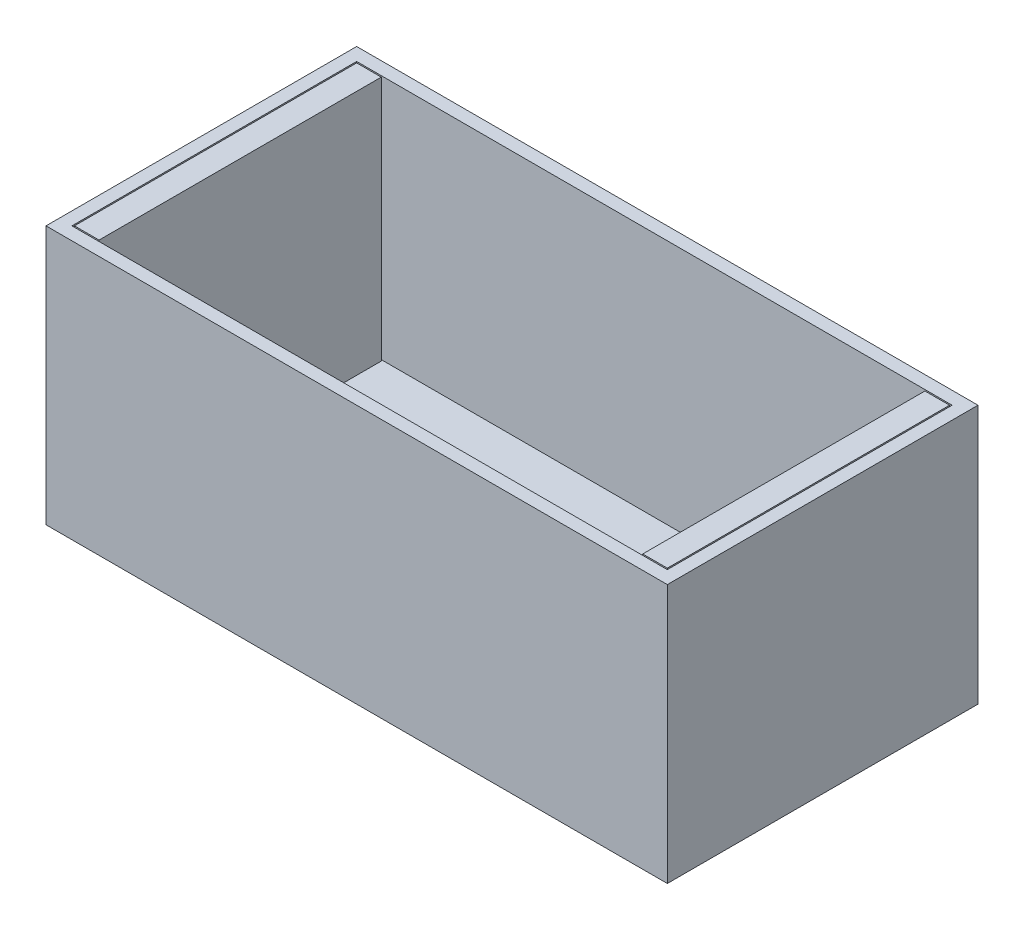
ISO-10303-21;
HEADER;
FILE_DESCRIPTION(('STEP AP214'),'2;1');
FILE_NAME('part.step','',(''),(''),'','','');
FILE_SCHEMA(('AUTOMOTIVE_DESIGN { 1 0 10303 214 1 1 1 1 }'));
ENDSEC;
DATA;
#1=APPLICATION_CONTEXT('core data for automotive mechanical design processes');
#2=APPLICATION_PROTOCOL_DEFINITION('international standard','automotive_design',2000,#1);
#3=PRODUCT_CONTEXT('',#1,'mechanical');
#4=PRODUCT('Part','Part','',(#3));
#5=PRODUCT_RELATED_PRODUCT_CATEGORY('part','',(#4));
#6=PRODUCT_DEFINITION_FORMATION('','',#4);
#7=PRODUCT_DEFINITION_CONTEXT('part definition',#1,'design');
#8=PRODUCT_DEFINITION('design','',#6,#7);
#9=PRODUCT_DEFINITION_SHAPE('','',#8);
#10=(LENGTH_UNIT() NAMED_UNIT(*) SI_UNIT(.MILLI.,.METRE.));
#11=(NAMED_UNIT(*) PLANE_ANGLE_UNIT() SI_UNIT($,.RADIAN.));
#12=(NAMED_UNIT(*) SI_UNIT($,.STERADIAN.) SOLID_ANGLE_UNIT());
#13=UNCERTAINTY_MEASURE_WITH_UNIT(LENGTH_MEASURE(1.E-05),#10,'distance_accuracy_value','');
#14=(GEOMETRIC_REPRESENTATION_CONTEXT(3) GLOBAL_UNCERTAINTY_ASSIGNED_CONTEXT((#13)) GLOBAL_UNIT_ASSIGNED_CONTEXT((#10,
#11,#12)) REPRESENTATION_CONTEXT('',''));
#15=CARTESIAN_POINT('',(0.,0.,0.));
#16=DIRECTION('',(0.,0.,1.));
#17=DIRECTION('',(1.,0.,0.));
#18=AXIS2_PLACEMENT_3D('',#15,#16,#17);
#19=CARTESIAN_POINT('',(0.,12.7,0.));
#20=DIRECTION('',(0.,-1.,0.));
#21=DIRECTION('',(0.,0.,-1.));
#22=AXIS2_PLACEMENT_3D('',#19,#20,#21);
#23=PLANE('',#22);
#24=DIRECTION('',(1.,0.,0.));
#25=VECTOR('',#24,1.);
#26=CARTESIAN_POINT('',(290.83,12.7,-138.43));
#27=LINE('',#26,#25);
#28=CARTESIAN_POINT('',(266.7,12.7,-138.43));
#29=VERTEX_POINT('',#28);
#30=CARTESIAN_POINT('',(290.83,12.7,-138.43));
#31=VERTEX_POINT('',#30);
#32=EDGE_CURVE('E183',#29,#31,#27,.T.);
#33=ORIENTED_EDGE('',*,*,#32,.T.);
#34=DIRECTION('',(0.,0.,1.));
#35=VECTOR('',#34,1.);
#36=CARTESIAN_POINT('',(290.83,12.7,-138.43));
#37=LINE('',#36,#35);
#38=CARTESIAN_POINT('',(290.83,12.7,138.43));
#39=VERTEX_POINT('',#38);
#40=EDGE_CURVE('E157',#31,#39,#37,.T.);
#41=ORIENTED_EDGE('',*,*,#40,.T.);
#42=DIRECTION('',(-1.,0.,0.));
#43=VECTOR('',#42,1.);
#44=CARTESIAN_POINT('',(290.83,12.7,138.43));
#45=LINE('',#44,#43);
#46=CARTESIAN_POINT('',(266.7,12.7,138.43));
#47=VERTEX_POINT('',#46);
#48=EDGE_CURVE('E173',#39,#47,#45,.T.);
#49=ORIENTED_EDGE('',*,*,#48,.T.);
#50=DIRECTION('',(0.,0.,-1.));
#51=VECTOR('',#50,1.);
#52=CARTESIAN_POINT('',(266.7,12.7,-138.43));
#53=LINE('',#52,#51);
#54=EDGE_CURVE('E54',#47,#29,#53,.T.);
#55=ORIENTED_EDGE('',*,*,#54,.T.);
#56=EDGE_LOOP('',(#33,#41,#49,#55));
#57=FACE_BOUND('',#56,.T.);
#58=DIRECTION('',(0.,0.,-1.));
#59=VECTOR('',#58,1.);
#60=CARTESIAN_POINT('',(-292.1,12.7,0.));
#61=LINE('',#60,#59);
#62=CARTESIAN_POINT('',(-292.1,12.7,139.7));
#63=VERTEX_POINT('',#62);
#64=CARTESIAN_POINT('',(-292.1,12.7,-139.7));
#65=VERTEX_POINT('',#64);
#66=EDGE_CURVE('E221',#63,#65,#61,.T.);
#67=ORIENTED_EDGE('',*,*,#66,.F.);
#68=DIRECTION('',(1.,0.,0.));
#69=VECTOR('',#68,1.);
#70=CARTESIAN_POINT('',(0.,12.7,139.7));
#71=LINE('',#70,#69);
#72=CARTESIAN_POINT('',(292.1,12.7,139.7));
#73=VERTEX_POINT('',#72);
#74=EDGE_CURVE('E233',#63,#73,#71,.T.);
#75=ORIENTED_EDGE('',*,*,#74,.T.);
#76=DIRECTION('',(0.,0.,-1.));
#77=VECTOR('',#76,1.);
#78=CARTESIAN_POINT('',(292.1,12.7,0.));
#79=LINE('',#78,#77);
#80=CARTESIAN_POINT('',(292.1,12.7,-139.7));
#81=VERTEX_POINT('',#80);
#82=EDGE_CURVE('E236',#73,#81,#79,.T.);
#83=ORIENTED_EDGE('',*,*,#82,.T.);
#84=DIRECTION('',(1.,0.,0.));
#85=VECTOR('',#84,1.);
#86=CARTESIAN_POINT('',(0.,12.7,-139.7));
#87=LINE('',#86,#85);
#88=EDGE_CURVE('E224',#65,#81,#87,.T.);
#89=ORIENTED_EDGE('',*,*,#88,.F.);
#90=EDGE_LOOP('',(#67,#75,#83,#89));
#91=FACE_BOUND('',#90,.T.);
#92=DIRECTION('',(0.,0.,1.));
#93=VECTOR('',#92,1.);
#94=CARTESIAN_POINT('',(-290.83,12.7,-138.43));
#95=LINE('',#94,#93);
#96=CARTESIAN_POINT('',(-290.83,12.7,-138.43));
#97=VERTEX_POINT('',#96);
#98=CARTESIAN_POINT('',(-290.83,12.7,138.43));
#99=VERTEX_POINT('',#98);
#100=EDGE_CURVE('E162',#97,#99,#95,.T.);
#101=ORIENTED_EDGE('',*,*,#100,.F.);
#102=DIRECTION('',(-1.,0.,0.));
#103=VECTOR('',#102,1.);
#104=CARTESIAN_POINT('',(-290.83,12.7,-138.43));
#105=LINE('',#104,#103);
#106=CARTESIAN_POINT('',(-266.7,12.7,-138.43));
#107=VERTEX_POINT('',#106);
#108=EDGE_CURVE('E196',#107,#97,#105,.T.);
#109=ORIENTED_EDGE('',*,*,#108,.F.);
#110=DIRECTION('',(0.,0.,-1.));
#111=VECTOR('',#110,1.);
#112=CARTESIAN_POINT('',(-266.7,12.7,-138.43));
#113=LINE('',#112,#111);
#114=CARTESIAN_POINT('',(-266.7,12.7,138.43));
#115=VERTEX_POINT('',#114);
#116=EDGE_CURVE('E206',#115,#107,#113,.T.);
#117=ORIENTED_EDGE('',*,*,#116,.F.);
#118=DIRECTION('',(1.,0.,0.));
#119=VECTOR('',#118,1.);
#120=CARTESIAN_POINT('',(-290.83,12.7,138.43));
#121=LINE('',#120,#119);
#122=EDGE_CURVE('E62',#99,#115,#121,.T.);
#123=ORIENTED_EDGE('',*,*,#122,.F.);
#124=EDGE_LOOP('',(#101,#109,#117,#123));
#125=FACE_BOUND('',#124,.T.);
#126=ADVANCED_FACE('F37',(#57,#91,#125),#23,.F.);
#127=CARTESIAN_POINT('',(-304.8,254.,152.4));
#128=DIRECTION('',(-1.,0.,0.));
#129=DIRECTION('',(0.,0.,1.));
#130=AXIS2_PLACEMENT_3D('',#127,#128,#129);
#131=PLANE('',#130);
#132=DIRECTION('',(0.,0.,-1.));
#133=VECTOR('',#132,1.);
#134=CARTESIAN_POINT('',(-304.8,0.,152.4));
#135=LINE('',#134,#133);
#136=CARTESIAN_POINT('',(-304.8,0.,152.4));
#137=VERTEX_POINT('',#136);
#138=CARTESIAN_POINT('',(-304.8,0.,-152.4));
#139=VERTEX_POINT('',#138);
#140=EDGE_CURVE('E227',#137,#139,#135,.T.);
#141=ORIENTED_EDGE('',*,*,#140,.F.);
#142=DIRECTION('',(0.,-1.,0.));
#143=VECTOR('',#142,1.);
#144=CARTESIAN_POINT('',(-304.8,254.,152.4));
#145=LINE('',#144,#143);
#146=CARTESIAN_POINT('',(-304.8,254.,152.4));
#147=VERTEX_POINT('',#146);
#148=EDGE_CURVE('E11',#147,#137,#145,.T.);
#149=ORIENTED_EDGE('',*,*,#148,.F.);
#150=DIRECTION('',(0.,0.,-1.));
#151=VECTOR('',#150,1.);
#152=CARTESIAN_POINT('',(-304.8,254.,152.4));
#153=LINE('',#152,#151);
#154=CARTESIAN_POINT('',(-304.8,254.,-152.4));
#155=VERTEX_POINT('',#154);
#156=EDGE_CURVE('E253',#147,#155,#153,.T.);
#157=ORIENTED_EDGE('',*,*,#156,.T.);
#158=DIRECTION('',(0.,-1.,0.));
#159=VECTOR('',#158,1.);
#160=CARTESIAN_POINT('',(-304.8,254.,-152.4));
#161=LINE('',#160,#159);
#162=EDGE_CURVE('E41',#155,#139,#161,.T.);
#163=ORIENTED_EDGE('',*,*,#162,.T.);
#164=EDGE_LOOP('',(#141,#149,#157,#163));
#165=FACE_BOUND('',#164,.T.);
#166=ADVANCED_FACE('F39',(#165),#131,.T.);
#167=CARTESIAN_POINT('',(-304.8,254.,152.4));
#168=DIRECTION('',(0.,0.,-1.));
#169=DIRECTION('',(-1.,0.,0.));
#170=AXIS2_PLACEMENT_3D('',#167,#168,#169);
#171=PLANE('',#170);
#172=DIRECTION('',(1.,0.,0.));
#173=VECTOR('',#172,1.);
#174=CARTESIAN_POINT('',(-304.8,0.,152.4));
#175=LINE('',#174,#173);
#176=CARTESIAN_POINT('',(304.8,0.,152.4));
#177=VERTEX_POINT('',#176);
#178=EDGE_CURVE('E257',#137,#177,#175,.T.);
#179=ORIENTED_EDGE('',*,*,#178,.T.);
#180=DIRECTION('',(0.,-1.,0.));
#181=VECTOR('',#180,1.);
#182=CARTESIAN_POINT('',(304.8,254.,152.4));
#183=LINE('',#182,#181);
#184=CARTESIAN_POINT('',(304.8,254.,152.4));
#185=VERTEX_POINT('',#184);
#186=EDGE_CURVE('E46',#185,#177,#183,.T.);
#187=ORIENTED_EDGE('',*,*,#186,.F.);
#188=DIRECTION('',(1.,0.,0.));
#189=VECTOR('',#188,1.);
#190=CARTESIAN_POINT('',(-304.8,254.,152.4));
#191=LINE('',#190,#189);
#192=EDGE_CURVE('E262',#147,#185,#191,.T.);
#193=ORIENTED_EDGE('',*,*,#192,.F.);
#194=ORIENTED_EDGE('',*,*,#148,.T.);
#195=EDGE_LOOP('',(#179,#187,#193,#194));
#196=FACE_BOUND('',#195,.T.);
#197=ADVANCED_FACE('F289',(#196),#171,.F.);
#198=CARTESIAN_POINT('',(304.8,254.,152.4));
#199=DIRECTION('',(-1.,0.,0.));
#200=DIRECTION('',(0.,0.,1.));
#201=AXIS2_PLACEMENT_3D('',#198,#199,#200);
#202=PLANE('',#201);
#203=DIRECTION('',(0.,0.,-1.));
#204=VECTOR('',#203,1.);
#205=CARTESIAN_POINT('',(304.8,0.,152.4));
#206=LINE('',#205,#204);
#207=CARTESIAN_POINT('',(304.8,0.,-152.4));
#208=VERTEX_POINT('',#207);
#209=EDGE_CURVE('E269',#177,#208,#206,.T.);
#210=ORIENTED_EDGE('',*,*,#209,.T.);
#211=DIRECTION('',(0.,-1.,0.));
#212=VECTOR('',#211,1.);
#213=CARTESIAN_POINT('',(304.8,254.,-152.4));
#214=LINE('',#213,#212);
#215=CARTESIAN_POINT('',(304.8,254.,-152.4));
#216=VERTEX_POINT('',#215);
#217=EDGE_CURVE('E274',#216,#208,#214,.T.);
#218=ORIENTED_EDGE('',*,*,#217,.F.);
#219=DIRECTION('',(0.,0.,-1.));
#220=VECTOR('',#219,1.);
#221=CARTESIAN_POINT('',(304.8,254.,152.4));
#222=LINE('',#221,#220);
#223=EDGE_CURVE('E260',#185,#216,#222,.T.);
#224=ORIENTED_EDGE('',*,*,#223,.F.);
#225=ORIENTED_EDGE('',*,*,#186,.T.);
#226=EDGE_LOOP('',(#210,#218,#224,#225));
#227=FACE_BOUND('',#226,.T.);
#228=ADVANCED_FACE('F293',(#227),#202,.F.);
#229=CARTESIAN_POINT('',(-304.8,254.,-152.4));
#230=DIRECTION('',(0.,0.,-1.));
#231=DIRECTION('',(-1.,0.,0.));
#232=AXIS2_PLACEMENT_3D('',#229,#230,#231);
#233=PLANE('',#232);
#234=DIRECTION('',(1.,0.,0.));
#235=VECTOR('',#234,1.);
#236=CARTESIAN_POINT('',(-304.8,0.,-152.4));
#237=LINE('',#236,#235);
#238=EDGE_CURVE('E266',#139,#208,#237,.T.);
#239=ORIENTED_EDGE('',*,*,#238,.F.);
#240=ORIENTED_EDGE('',*,*,#162,.F.);
#241=DIRECTION('',(1.,0.,0.));
#242=VECTOR('',#241,1.);
#243=CARTESIAN_POINT('',(-304.8,254.,-152.4));
#244=LINE('',#243,#242);
#245=EDGE_CURVE('E256',#155,#216,#244,.T.);
#246=ORIENTED_EDGE('',*,*,#245,.T.);
#247=ORIENTED_EDGE('',*,*,#217,.T.);
#248=EDGE_LOOP('',(#239,#240,#246,#247));
#249=FACE_BOUND('',#248,.T.);
#250=ADVANCED_FACE('F282',(#249),#233,.T.);
#251=CARTESIAN_POINT('',(0.,254.,0.));
#252=DIRECTION('',(0.,-1.,0.));
#253=DIRECTION('',(0.,0.,-1.));
#254=AXIS2_PLACEMENT_3D('',#251,#252,#253);
#255=PLANE('',#254);
#256=DIRECTION('',(1.,0.,0.));
#257=VECTOR('',#256,1.);
#258=CARTESIAN_POINT('',(0.,254.,139.7));
#259=LINE('',#258,#257);
#260=CARTESIAN_POINT('',(-292.1,254.,139.7));
#261=VERTEX_POINT('',#260);
#262=CARTESIAN_POINT('',(292.1,254.,139.7));
#263=VERTEX_POINT('',#262);
#264=EDGE_CURVE('E232',#261,#263,#259,.T.);
#265=ORIENTED_EDGE('',*,*,#264,.F.);
#266=DIRECTION('',(0.,0.,-1.));
#267=VECTOR('',#266,1.);
#268=CARTESIAN_POINT('',(-292.1,254.,0.));
#269=LINE('',#268,#267);
#270=CARTESIAN_POINT('',(-292.1,254.,-139.7));
#271=VERTEX_POINT('',#270);
#272=EDGE_CURVE('E235',#261,#271,#269,.T.);
#273=ORIENTED_EDGE('',*,*,#272,.T.);
#274=DIRECTION('',(1.,0.,0.));
#275=VECTOR('',#274,1.);
#276=CARTESIAN_POINT('',(0.,254.,-139.7));
#277=LINE('',#276,#275);
#278=CARTESIAN_POINT('',(292.1,254.,-139.7));
#279=VERTEX_POINT('',#278);
#280=EDGE_CURVE('E246',#271,#279,#277,.T.);
#281=ORIENTED_EDGE('',*,*,#280,.T.);
#282=DIRECTION('',(0.,0.,-1.));
#283=VECTOR('',#282,1.);
#284=CARTESIAN_POINT('',(292.1,254.,0.));
#285=LINE('',#284,#283);
#286=EDGE_CURVE('E248',#263,#279,#285,.T.);
#287=ORIENTED_EDGE('',*,*,#286,.F.);
#288=EDGE_LOOP('',(#265,#273,#281,#287));
#289=FACE_BOUND('',#288,.T.);
#290=ORIENTED_EDGE('',*,*,#156,.F.);
#291=ORIENTED_EDGE('',*,*,#192,.T.);
#292=ORIENTED_EDGE('',*,*,#223,.T.);
#293=ORIENTED_EDGE('',*,*,#245,.F.);
#294=EDGE_LOOP('',(#290,#291,#292,#293));
#295=FACE_BOUND('',#294,.T.);
#296=ADVANCED_FACE('F295',(#289,#295),#255,.F.);
#297=CARTESIAN_POINT('',(0.,0.,0.));
#298=DIRECTION('',(0.,-1.,0.));
#299=DIRECTION('',(0.,0.,-1.));
#300=AXIS2_PLACEMENT_3D('',#297,#298,#299);
#301=PLANE('',#300);
#302=ORIENTED_EDGE('',*,*,#140,.T.);
#303=ORIENTED_EDGE('',*,*,#238,.T.);
#304=ORIENTED_EDGE('',*,*,#209,.F.);
#305=ORIENTED_EDGE('',*,*,#178,.F.);
#306=EDGE_LOOP('',(#302,#303,#304,#305));
#307=FACE_BOUND('',#306,.T.);
#308=ADVANCED_FACE('F286',(#307),#301,.T.);
#309=CARTESIAN_POINT('',(-292.1,254.,152.4));
#310=DIRECTION('',(-1.,0.,0.));
#311=DIRECTION('',(0.,0.,1.));
#312=AXIS2_PLACEMENT_3D('',#309,#310,#311);
#313=PLANE('',#312);
#314=ORIENTED_EDGE('',*,*,#66,.T.);
#315=DIRECTION('',(0.,-1.,0.));
#316=VECTOR('',#315,1.);
#317=CARTESIAN_POINT('',(-292.1,254.,-139.7));
#318=LINE('',#317,#316);
#319=EDGE_CURVE('E229',#271,#65,#318,.T.);
#320=ORIENTED_EDGE('',*,*,#319,.F.);
#321=ORIENTED_EDGE('',*,*,#272,.F.);
#322=DIRECTION('',(0.,-1.,0.));
#323=VECTOR('',#322,1.);
#324=CARTESIAN_POINT('',(-292.1,254.,139.7));
#325=LINE('',#324,#323);
#326=EDGE_CURVE('E225',#261,#63,#325,.T.);
#327=ORIENTED_EDGE('',*,*,#326,.T.);
#328=EDGE_LOOP('',(#314,#320,#321,#327));
#329=FACE_BOUND('',#328,.T.);
#330=ADVANCED_FACE('F303',(#329),#313,.F.);
#331=CARTESIAN_POINT('',(-304.8,254.,139.7));
#332=DIRECTION('',(0.,0.,-1.));
#333=DIRECTION('',(-1.,0.,0.));
#334=AXIS2_PLACEMENT_3D('',#331,#332,#333);
#335=PLANE('',#334);
#336=ORIENTED_EDGE('',*,*,#74,.F.);
#337=ORIENTED_EDGE('',*,*,#326,.F.);
#338=ORIENTED_EDGE('',*,*,#264,.T.);
#339=DIRECTION('',(0.,-1.,0.));
#340=VECTOR('',#339,1.);
#341=CARTESIAN_POINT('',(292.1,254.,139.7));
#342=LINE('',#341,#340);
#343=EDGE_CURVE('E228',#263,#73,#342,.T.);
#344=ORIENTED_EDGE('',*,*,#343,.T.);
#345=EDGE_LOOP('',(#336,#337,#338,#344));
#346=FACE_BOUND('',#345,.T.);
#347=ADVANCED_FACE('F322',(#346),#335,.T.);
#348=CARTESIAN_POINT('',(292.1,254.,152.4));
#349=DIRECTION('',(-1.,0.,0.));
#350=DIRECTION('',(0.,0.,1.));
#351=AXIS2_PLACEMENT_3D('',#348,#349,#350);
#352=PLANE('',#351);
#353=ORIENTED_EDGE('',*,*,#82,.F.);
#354=ORIENTED_EDGE('',*,*,#343,.F.);
#355=ORIENTED_EDGE('',*,*,#286,.T.);
#356=DIRECTION('',(0.,-1.,0.));
#357=VECTOR('',#356,1.);
#358=CARTESIAN_POINT('',(292.1,254.,-139.7));
#359=LINE('',#358,#357);
#360=EDGE_CURVE('E231',#279,#81,#359,.T.);
#361=ORIENTED_EDGE('',*,*,#360,.T.);
#362=EDGE_LOOP('',(#353,#354,#355,#361));
#363=FACE_BOUND('',#362,.T.);
#364=ADVANCED_FACE('F318',(#363),#352,.T.);
#365=CARTESIAN_POINT('',(-304.8,254.,-139.7));
#366=DIRECTION('',(0.,0.,-1.));
#367=DIRECTION('',(-1.,0.,0.));
#368=AXIS2_PLACEMENT_3D('',#365,#366,#367);
#369=PLANE('',#368);
#370=ORIENTED_EDGE('',*,*,#88,.T.);
#371=ORIENTED_EDGE('',*,*,#360,.F.);
#372=ORIENTED_EDGE('',*,*,#280,.F.);
#373=ORIENTED_EDGE('',*,*,#319,.T.);
#374=EDGE_LOOP('',(#370,#371,#372,#373));
#375=FACE_BOUND('',#374,.T.);
#376=ADVANCED_FACE('F314',(#375),#369,.F.);
#377=CARTESIAN_POINT('',(-290.83,254.,-138.43));
#378=DIRECTION('',(1.,0.,0.));
#379=DIRECTION('',(0.,0.,-1.));
#380=AXIS2_PLACEMENT_3D('',#377,#378,#379);
#381=PLANE('',#380);
#382=ORIENTED_EDGE('',*,*,#100,.T.);
#383=DIRECTION('',(0.,-1.,0.));
#384=VECTOR('',#383,1.);
#385=CARTESIAN_POINT('',(-290.83,254.,138.43));
#386=LINE('',#385,#384);
#387=CARTESIAN_POINT('',(-290.83,254.,138.43));
#388=VERTEX_POINT('',#387);
#389=EDGE_CURVE('E219',#388,#99,#386,.T.);
#390=ORIENTED_EDGE('',*,*,#389,.F.);
#391=DIRECTION('',(0.,0.,1.));
#392=VECTOR('',#391,1.);
#393=CARTESIAN_POINT('',(-290.83,254.,-138.43));
#394=LINE('',#393,#392);
#395=CARTESIAN_POINT('',(-290.83,254.,-138.43));
#396=VERTEX_POINT('',#395);
#397=EDGE_CURVE('E192',#396,#388,#394,.T.);
#398=ORIENTED_EDGE('',*,*,#397,.F.);
#399=DIRECTION('',(0.,-1.,0.));
#400=VECTOR('',#399,1.);
#401=CARTESIAN_POINT('',(-290.83,254.,-138.43));
#402=LINE('',#401,#400);
#403=EDGE_CURVE('E202',#396,#97,#402,.T.);
#404=ORIENTED_EDGE('',*,*,#403,.T.);
#405=EDGE_LOOP('',(#382,#390,#398,#404));
#406=FACE_BOUND('',#405,.T.);
#407=ADVANCED_FACE('F317',(#406),#381,.F.);
#408=CARTESIAN_POINT('',(-290.83,254.,138.43));
#409=DIRECTION('',(0.,0.,-1.));
#410=DIRECTION('',(-1.,0.,0.));
#411=AXIS2_PLACEMENT_3D('',#408,#409,#410);
#412=PLANE('',#411);
#413=ORIENTED_EDGE('',*,*,#122,.T.);
#414=DIRECTION('',(0.,-1.,0.));
#415=VECTOR('',#414,1.);
#416=CARTESIAN_POINT('',(-266.7,254.,138.43));
#417=LINE('',#416,#415);
#418=CARTESIAN_POINT('',(-266.7,254.,138.43));
#419=VERTEX_POINT('',#418);
#420=EDGE_CURVE('E216',#419,#115,#417,.T.);
#421=ORIENTED_EDGE('',*,*,#420,.F.);
#422=DIRECTION('',(1.,0.,0.));
#423=VECTOR('',#422,1.);
#424=CARTESIAN_POINT('',(-290.83,254.,138.43));
#425=LINE('',#424,#423);
#426=EDGE_CURVE('E195',#388,#419,#425,.T.);
#427=ORIENTED_EDGE('',*,*,#426,.F.);
#428=ORIENTED_EDGE('',*,*,#389,.T.);
#429=EDGE_LOOP('',(#413,#421,#427,#428));
#430=FACE_BOUND('',#429,.T.);
#431=ADVANCED_FACE('F332',(#430),#412,.F.);
#432=CARTESIAN_POINT('',(-266.7,254.,-138.43));
#433=DIRECTION('',(-1.,0.,0.));
#434=DIRECTION('',(0.,0.,1.));
#435=AXIS2_PLACEMENT_3D('',#432,#433,#434);
#436=PLANE('',#435);
#437=ORIENTED_EDGE('',*,*,#116,.T.);
#438=DIRECTION('',(0.,-1.,0.));
#439=VECTOR('',#438,1.);
#440=CARTESIAN_POINT('',(-266.7,254.,-138.43));
#441=LINE('',#440,#439);
#442=CARTESIAN_POINT('',(-266.7,254.,-138.43));
#443=VERTEX_POINT('',#442);
#444=EDGE_CURVE('E213',#443,#107,#441,.T.);
#445=ORIENTED_EDGE('',*,*,#444,.F.);
#446=DIRECTION('',(0.,0.,-1.));
#447=VECTOR('',#446,1.);
#448=CARTESIAN_POINT('',(-266.7,254.,-138.43));
#449=LINE('',#448,#447);
#450=EDGE_CURVE('E198',#419,#443,#449,.T.);
#451=ORIENTED_EDGE('',*,*,#450,.F.);
#452=ORIENTED_EDGE('',*,*,#420,.T.);
#453=EDGE_LOOP('',(#437,#445,#451,#452));
#454=FACE_BOUND('',#453,.T.);
#455=ADVANCED_FACE('F336',(#454),#436,.F.);
#456=CARTESIAN_POINT('',(-290.83,254.,-138.43));
#457=DIRECTION('',(0.,0.,1.));
#458=DIRECTION('',(1.,0.,0.));
#459=AXIS2_PLACEMENT_3D('',#456,#457,#458);
#460=PLANE('',#459);
#461=ORIENTED_EDGE('',*,*,#108,.T.);
#462=ORIENTED_EDGE('',*,*,#403,.F.);
#463=DIRECTION('',(-1.,0.,0.));
#464=VECTOR('',#463,1.);
#465=CARTESIAN_POINT('',(-290.83,254.,-138.43));
#466=LINE('',#465,#464);
#467=EDGE_CURVE('E200',#443,#396,#466,.T.);
#468=ORIENTED_EDGE('',*,*,#467,.F.);
#469=ORIENTED_EDGE('',*,*,#444,.T.);
#470=EDGE_LOOP('',(#461,#462,#468,#469));
#471=FACE_BOUND('',#470,.T.);
#472=ADVANCED_FACE('F340',(#471),#460,.F.);
#473=CARTESIAN_POINT('',(0.,254.,0.));
#474=DIRECTION('',(0.,1.,0.));
#475=DIRECTION('',(0.,0.,1.));
#476=AXIS2_PLACEMENT_3D('',#473,#474,#475);
#477=PLANE('',#476);
#478=ORIENTED_EDGE('',*,*,#397,.T.);
#479=ORIENTED_EDGE('',*,*,#426,.T.);
#480=ORIENTED_EDGE('',*,*,#450,.T.);
#481=ORIENTED_EDGE('',*,*,#467,.T.);
#482=EDGE_LOOP('',(#478,#479,#480,#481));
#483=FACE_BOUND('',#482,.T.);
#484=ADVANCED_FACE('F344',(#483),#477,.T.);
#485=CARTESIAN_POINT('',(290.83,254.,-138.43));
#486=DIRECTION('',(1.,0.,0.));
#487=DIRECTION('',(0.,0.,-1.));
#488=AXIS2_PLACEMENT_3D('',#485,#486,#487);
#489=PLANE('',#488);
#490=ORIENTED_EDGE('',*,*,#40,.F.);
#491=DIRECTION('',(0.,-1.,0.));
#492=VECTOR('',#491,1.);
#493=CARTESIAN_POINT('',(290.83,254.,-138.43));
#494=LINE('',#493,#492);
#495=CARTESIAN_POINT('',(290.83,254.,-138.43));
#496=VERTEX_POINT('',#495);
#497=EDGE_CURVE('E151',#496,#31,#494,.T.);
#498=ORIENTED_EDGE('',*,*,#497,.F.);
#499=DIRECTION('',(0.,0.,1.));
#500=VECTOR('',#499,1.);
#501=CARTESIAN_POINT('',(290.83,254.,-138.43));
#502=LINE('',#501,#500);
#503=CARTESIAN_POINT('',(290.83,254.,138.43));
#504=VERTEX_POINT('',#503);
#505=EDGE_CURVE('E154',#496,#504,#502,.T.);
#506=ORIENTED_EDGE('',*,*,#505,.T.);
#507=DIRECTION('',(0.,-1.,0.));
#508=VECTOR('',#507,1.);
#509=CARTESIAN_POINT('',(290.83,254.,138.43));
#510=LINE('',#509,#508);
#511=EDGE_CURVE('E181',#504,#39,#510,.T.);
#512=ORIENTED_EDGE('',*,*,#511,.T.);
#513=EDGE_LOOP('',(#490,#498,#506,#512));
#514=FACE_BOUND('',#513,.T.);
#515=ADVANCED_FACE('F153',(#514),#489,.T.);
#516=CARTESIAN_POINT('',(290.83,254.,-138.43));
#517=DIRECTION('',(0.,0.,-1.));
#518=DIRECTION('',(-1.,0.,0.));
#519=AXIS2_PLACEMENT_3D('',#516,#517,#518);
#520=PLANE('',#519);
#521=ORIENTED_EDGE('',*,*,#32,.F.);
#522=DIRECTION('',(0.,-1.,0.));
#523=VECTOR('',#522,1.);
#524=CARTESIAN_POINT('',(266.7,254.,-138.43));
#525=LINE('',#524,#523);
#526=CARTESIAN_POINT('',(266.7,254.,-138.43));
#527=VERTEX_POINT('',#526);
#528=EDGE_CURVE('E163',#527,#29,#525,.T.);
#529=ORIENTED_EDGE('',*,*,#528,.F.);
#530=DIRECTION('',(1.,0.,0.));
#531=VECTOR('',#530,1.);
#532=CARTESIAN_POINT('',(290.83,254.,-138.43));
#533=LINE('',#532,#531);
#534=EDGE_CURVE('E169',#527,#496,#533,.T.);
#535=ORIENTED_EDGE('',*,*,#534,.T.);
#536=ORIENTED_EDGE('',*,*,#497,.T.);
#537=EDGE_LOOP('',(#521,#529,#535,#536));
#538=FACE_BOUND('',#537,.T.);
#539=ADVANCED_FACE('F175',(#538),#520,.T.);
#540=CARTESIAN_POINT('',(266.7,254.,-138.43));
#541=DIRECTION('',(-1.,0.,0.));
#542=DIRECTION('',(0.,0.,1.));
#543=AXIS2_PLACEMENT_3D('',#540,#541,#542);
#544=PLANE('',#543);
#545=ORIENTED_EDGE('',*,*,#54,.F.);
#546=DIRECTION('',(0.,-1.,0.));
#547=VECTOR('',#546,1.);
#548=CARTESIAN_POINT('',(266.7,254.,138.43));
#549=LINE('',#548,#547);
#550=CARTESIAN_POINT('',(266.7,254.,138.43));
#551=VERTEX_POINT('',#550);
#552=EDGE_CURVE('E189',#551,#47,#549,.T.);
#553=ORIENTED_EDGE('',*,*,#552,.F.);
#554=DIRECTION('',(0.,0.,-1.));
#555=VECTOR('',#554,1.);
#556=CARTESIAN_POINT('',(266.7,254.,-138.43));
#557=LINE('',#556,#555);
#558=EDGE_CURVE('E176',#551,#527,#557,.T.);
#559=ORIENTED_EDGE('',*,*,#558,.T.);
#560=ORIENTED_EDGE('',*,*,#528,.T.);
#561=EDGE_LOOP('',(#545,#553,#559,#560));
#562=FACE_BOUND('',#561,.T.);
#563=ADVANCED_FACE('F353',(#562),#544,.T.);
#564=CARTESIAN_POINT('',(290.83,254.,138.43));
#565=DIRECTION('',(0.,0.,1.));
#566=DIRECTION('',(1.,0.,0.));
#567=AXIS2_PLACEMENT_3D('',#564,#565,#566);
#568=PLANE('',#567);
#569=ORIENTED_EDGE('',*,*,#48,.F.);
#570=ORIENTED_EDGE('',*,*,#511,.F.);
#571=DIRECTION('',(-1.,0.,0.));
#572=VECTOR('',#571,1.);
#573=CARTESIAN_POINT('',(290.83,254.,138.43));
#574=LINE('',#573,#572);
#575=EDGE_CURVE('E172',#504,#551,#574,.T.);
#576=ORIENTED_EDGE('',*,*,#575,.T.);
#577=ORIENTED_EDGE('',*,*,#552,.T.);
#578=EDGE_LOOP('',(#569,#570,#576,#577));
#579=FACE_BOUND('',#578,.T.);
#580=ADVANCED_FACE('F356',(#579),#568,.T.);
#581=CARTESIAN_POINT('',(0.,254.,0.));
#582=DIRECTION('',(0.,1.,0.));
#583=DIRECTION('',(0.,0.,1.));
#584=AXIS2_PLACEMENT_3D('',#581,#582,#583);
#585=PLANE('',#584);
#586=ORIENTED_EDGE('',*,*,#505,.F.);
#587=ORIENTED_EDGE('',*,*,#534,.F.);
#588=ORIENTED_EDGE('',*,*,#558,.F.);
#589=ORIENTED_EDGE('',*,*,#575,.F.);
#590=EDGE_LOOP('',(#586,#587,#588,#589));
#591=FACE_BOUND('',#590,.T.);
#592=ADVANCED_FACE('F167',(#591),#585,.T.);
#593=CLOSED_SHELL('',(#126,#166,#197,#228,#250,#296,#308,#330,#347,#364,#376,#407,#431,#455,
#472,#484,#515,#539,#563,#580,#592));
#594=MANIFOLD_SOLID_BREP('B2',#593);
#595=ADVANCED_BREP_SHAPE_REPRESENTATION('',(#18,#594),#14);
#596=SHAPE_DEFINITION_REPRESENTATION(#9,#595);
ENDSEC;
END-ISO-10303-21;
